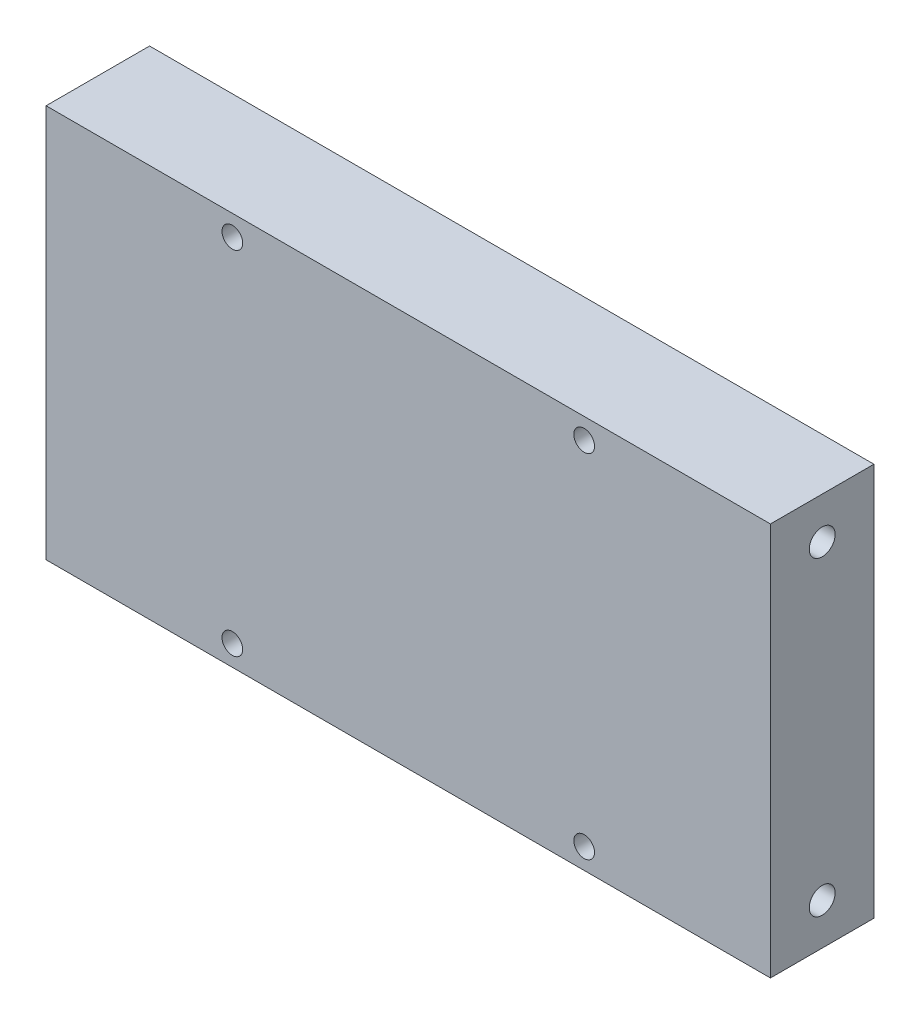
ISO-10303-21;
HEADER;
FILE_DESCRIPTION(('STEP AP214'),'2;1');
FILE_NAME('part.step','',(''),(''),'','','');
FILE_SCHEMA(('AUTOMOTIVE_DESIGN { 1 0 10303 214 1 1 1 1 }'));
ENDSEC;
DATA;
#1=APPLICATION_CONTEXT('core data for automotive mechanical design processes');
#2=APPLICATION_PROTOCOL_DEFINITION('international standard','automotive_design',2000,#1);
#3=PRODUCT_CONTEXT('',#1,'mechanical');
#4=PRODUCT('Part','Part','',(#3));
#5=PRODUCT_RELATED_PRODUCT_CATEGORY('part','',(#4));
#6=PRODUCT_DEFINITION_FORMATION('','',#4);
#7=PRODUCT_DEFINITION_CONTEXT('part definition',#1,'design');
#8=PRODUCT_DEFINITION('design','',#6,#7);
#9=PRODUCT_DEFINITION_SHAPE('','',#8);
#10=(LENGTH_UNIT() NAMED_UNIT(*) SI_UNIT(.MILLI.,.METRE.));
#11=(NAMED_UNIT(*) PLANE_ANGLE_UNIT() SI_UNIT($,.RADIAN.));
#12=(NAMED_UNIT(*) SI_UNIT($,.STERADIAN.) SOLID_ANGLE_UNIT());
#13=UNCERTAINTY_MEASURE_WITH_UNIT(LENGTH_MEASURE(1.E-05),#10,'distance_accuracy_value','');
#14=(GEOMETRIC_REPRESENTATION_CONTEXT(3) GLOBAL_UNCERTAINTY_ASSIGNED_CONTEXT((#13)) GLOBAL_UNIT_ASSIGNED_CONTEXT((#10,
#11,#12)) REPRESENTATION_CONTEXT('',''));
#15=CARTESIAN_POINT('',(0.,0.,0.));
#16=DIRECTION('',(0.,0.,1.));
#17=DIRECTION('',(1.,0.,0.));
#18=AXIS2_PLACEMENT_3D('',#15,#16,#17);
#19=CARTESIAN_POINT('',(0.,0.,10.));
#20=DIRECTION('',(0.,0.,-1.));
#21=DIRECTION('',(-1.,0.,0.));
#22=AXIS2_PLACEMENT_3D('',#19,#20,#21);
#23=PLANE('',#22);
#24=DIRECTION('',(0.,-1.,0.));
#25=VECTOR('',#24,1.);
#26=CARTESIAN_POINT('',(-39.6134615384542,13.9942307692308,10.));
#27=LINE('',#26,#25);
#28=CARTESIAN_POINT('',(-39.6134615384542,13.9942307692308,10.));
#29=VERTEX_POINT('',#28);
#30=CARTESIAN_POINT('',(-39.6134615384542,-24.0057692307692,10.));
#31=VERTEX_POINT('',#30);
#32=EDGE_CURVE('E85',#29,#31,#27,.T.);
#33=ORIENTED_EDGE('',*,*,#32,.T.);
#34=DIRECTION('',(1.,0.,0.));
#35=VECTOR('',#34,1.);
#36=CARTESIAN_POINT('',(30.3865384615459,-24.0057692307692,10.));
#37=LINE('',#36,#35);
#38=CARTESIAN_POINT('',(30.3865384615459,-24.0057692307692,10.));
#39=VERTEX_POINT('',#38);
#40=EDGE_CURVE('E80',#31,#39,#37,.T.);
#41=ORIENTED_EDGE('',*,*,#40,.T.);
#42=DIRECTION('',(0.,1.,0.));
#43=VECTOR('',#42,1.);
#44=CARTESIAN_POINT('',(30.3865384615459,13.9942307692308,10.));
#45=LINE('',#44,#43);
#46=CARTESIAN_POINT('',(30.3865384615459,13.9942307692308,10.));
#47=VERTEX_POINT('',#46);
#48=EDGE_CURVE('E83',#39,#47,#45,.T.);
#49=ORIENTED_EDGE('',*,*,#48,.T.);
#50=DIRECTION('',(-1.,0.,0.));
#51=VECTOR('',#50,1.);
#52=CARTESIAN_POINT('',(30.3865384615459,13.9942307692308,10.));
#53=LINE('',#52,#51);
#54=EDGE_CURVE('E50',#47,#29,#53,.T.);
#55=ORIENTED_EDGE('',*,*,#54,.T.);
#56=EDGE_LOOP('',(#33,#41,#49,#55));
#57=FACE_BOUND('',#56,.T.);
#58=CARTESIAN_POINT('',(-21.6134615384542,11.9942307692338,10.));
#59=DIRECTION('',(0.,0.,1.));
#60=DIRECTION('',(1.,0.,0.));
#61=AXIS2_PLACEMENT_3D('',#58,#59,#60);
#62=CIRCLE('',#61,1.);
#63=CARTESIAN_POINT('',(-20.6134615384542,11.9942307692338,10.));
#64=VERTEX_POINT('',#63);
#65=EDGE_CURVE('E100',#64,#64,#62,.T.);
#66=ORIENTED_EDGE('',*,*,#65,.F.);
#67=EDGE_LOOP('',(#66));
#68=FACE_BOUND('',#67,.T.);
#69=CARTESIAN_POINT('',(12.3865384615458,11.9942307692338,10.));
#70=DIRECTION('',(0.,0.,1.));
#71=DIRECTION('',(1.,0.,0.));
#72=AXIS2_PLACEMENT_3D('',#69,#70,#71);
#73=CIRCLE('',#72,1.);
#74=CARTESIAN_POINT('',(13.3865384615458,11.9942307692338,10.));
#75=VERTEX_POINT('',#74);
#76=EDGE_CURVE('E115',#75,#75,#73,.T.);
#77=ORIENTED_EDGE('',*,*,#76,.F.);
#78=EDGE_LOOP('',(#77));
#79=FACE_BOUND('',#78,.T.);
#80=CARTESIAN_POINT('',(12.3865384615458,-22.0057692307662,10.));
#81=DIRECTION('',(0.,0.,1.));
#82=DIRECTION('',(1.,0.,0.));
#83=AXIS2_PLACEMENT_3D('',#80,#81,#82);
#84=CIRCLE('',#83,1.);
#85=CARTESIAN_POINT('',(13.3865384615458,-22.0057692307662,10.));
#86=VERTEX_POINT('',#85);
#87=EDGE_CURVE('E121',#86,#86,#84,.T.);
#88=ORIENTED_EDGE('',*,*,#87,.F.);
#89=EDGE_LOOP('',(#88));
#90=FACE_BOUND('',#89,.T.);
#91=CARTESIAN_POINT('',(-21.6134615384542,-22.0057692307662,10.));
#92=DIRECTION('',(0.,0.,1.));
#93=DIRECTION('',(1.,0.,0.));
#94=AXIS2_PLACEMENT_3D('',#91,#92,#93);
#95=CIRCLE('',#94,1.);
#96=CARTESIAN_POINT('',(-20.6134615384542,-22.0057692307662,10.));
#97=VERTEX_POINT('',#96);
#98=EDGE_CURVE('E127',#97,#97,#95,.T.);
#99=ORIENTED_EDGE('',*,*,#98,.F.);
#100=EDGE_LOOP('',(#99));
#101=FACE_BOUND('',#100,.T.);
#102=ADVANCED_FACE('F33',(#57,#68,#79,#90,#101),#23,.F.);
#103=CARTESIAN_POINT('',(0.,0.,0.));
#104=DIRECTION('',(0.,0.,-1.));
#105=DIRECTION('',(-1.,0.,0.));
#106=AXIS2_PLACEMENT_3D('',#103,#104,#105);
#107=PLANE('',#106);
#108=CARTESIAN_POINT('',(12.3865384615458,-22.0057692307662,0.));
#109=DIRECTION('',(0.,0.,1.));
#110=DIRECTION('',(1.,0.,0.));
#111=AXIS2_PLACEMENT_3D('',#108,#109,#110);
#112=CIRCLE('',#111,1.);
#113=CARTESIAN_POINT('',(13.3865384615458,-22.0057692307662,0.));
#114=VERTEX_POINT('',#113);
#115=EDGE_CURVE('E124',#114,#114,#112,.T.);
#116=ORIENTED_EDGE('',*,*,#115,.T.);
#117=EDGE_LOOP('',(#116));
#118=FACE_BOUND('',#117,.T.);
#119=CARTESIAN_POINT('',(-21.6134615384542,11.9942307692338,0.));
#120=DIRECTION('',(0.,0.,1.));
#121=DIRECTION('',(1.,0.,0.));
#122=AXIS2_PLACEMENT_3D('',#119,#120,#121);
#123=CIRCLE('',#122,1.);
#124=CARTESIAN_POINT('',(-20.6134615384542,11.9942307692338,0.));
#125=VERTEX_POINT('',#124);
#126=EDGE_CURVE('E112',#125,#125,#123,.T.);
#127=ORIENTED_EDGE('',*,*,#126,.T.);
#128=EDGE_LOOP('',(#127));
#129=FACE_BOUND('',#128,.T.);
#130=DIRECTION('',(0.,-1.,0.));
#131=VECTOR('',#130,1.);
#132=CARTESIAN_POINT('',(-39.6134615384542,13.9942307692308,0.));
#133=LINE('',#132,#131);
#134=CARTESIAN_POINT('',(-39.6134615384542,13.9942307692308,0.));
#135=VERTEX_POINT('',#134);
#136=CARTESIAN_POINT('',(-39.6134615384542,-24.0057692307692,0.));
#137=VERTEX_POINT('',#136);
#138=EDGE_CURVE('E97',#135,#137,#133,.T.);
#139=ORIENTED_EDGE('',*,*,#138,.F.);
#140=DIRECTION('',(-1.,0.,0.));
#141=VECTOR('',#140,1.);
#142=CARTESIAN_POINT('',(30.3865384615459,13.9942307692308,0.));
#143=LINE('',#142,#141);
#144=CARTESIAN_POINT('',(30.3865384615459,13.9942307692308,0.));
#145=VERTEX_POINT('',#144);
#146=EDGE_CURVE('E73',#145,#135,#143,.T.);
#147=ORIENTED_EDGE('',*,*,#146,.F.);
#148=DIRECTION('',(0.,1.,0.));
#149=VECTOR('',#148,1.);
#150=CARTESIAN_POINT('',(30.3865384615459,13.9942307692308,0.));
#151=LINE('',#150,#149);
#152=CARTESIAN_POINT('',(30.3865384615459,-24.0057692307692,0.));
#153=VERTEX_POINT('',#152);
#154=EDGE_CURVE('E67',#153,#145,#151,.T.);
#155=ORIENTED_EDGE('',*,*,#154,.F.);
#156=DIRECTION('',(1.,0.,0.));
#157=VECTOR('',#156,1.);
#158=CARTESIAN_POINT('',(30.3865384615459,-24.0057692307692,0.));
#159=LINE('',#158,#157);
#160=EDGE_CURVE('E89',#137,#153,#159,.T.);
#161=ORIENTED_EDGE('',*,*,#160,.F.);
#162=EDGE_LOOP('',(#139,#147,#155,#161));
#163=FACE_BOUND('',#162,.T.);
#164=CARTESIAN_POINT('',(12.3865384615458,11.9942307692338,0.));
#165=DIRECTION('',(0.,0.,1.));
#166=DIRECTION('',(1.,0.,0.));
#167=AXIS2_PLACEMENT_3D('',#164,#165,#166);
#168=CIRCLE('',#167,1.);
#169=CARTESIAN_POINT('',(13.3865384615458,11.9942307692338,0.));
#170=VERTEX_POINT('',#169);
#171=EDGE_CURVE('E118',#170,#170,#168,.T.);
#172=ORIENTED_EDGE('',*,*,#171,.T.);
#173=EDGE_LOOP('',(#172));
#174=FACE_BOUND('',#173,.T.);
#175=CARTESIAN_POINT('',(-21.6134615384542,-22.0057692307662,0.));
#176=DIRECTION('',(0.,0.,1.));
#177=DIRECTION('',(1.,0.,0.));
#178=AXIS2_PLACEMENT_3D('',#175,#176,#177);
#179=CIRCLE('',#178,1.);
#180=CARTESIAN_POINT('',(-20.6134615384542,-22.0057692307662,0.));
#181=VERTEX_POINT('',#180);
#182=EDGE_CURVE('E130',#181,#181,#179,.T.);
#183=ORIENTED_EDGE('',*,*,#182,.T.);
#184=EDGE_LOOP('',(#183));
#185=FACE_BOUND('',#184,.T.);
#186=ADVANCED_FACE('F108',(#118,#129,#163,#174,#185),#107,.T.);
#187=CARTESIAN_POINT('',(-39.6134615384542,13.9942307692308,10.));
#188=DIRECTION('',(1.,0.,0.));
#189=DIRECTION('',(0.,0.,-1.));
#190=AXIS2_PLACEMENT_3D('',#187,#188,#189);
#191=PLANE('',#190);
#192=CARTESIAN_POINT('',(-39.6134615384542,9.99423076923078,5.));
#193=DIRECTION('',(1.,0.,0.));
#194=DIRECTION('',(0.,0.,-1.));
#195=AXIS2_PLACEMENT_3D('',#192,#193,#194);
#196=CIRCLE('',#195,1.25);
#197=CARTESIAN_POINT('',(-39.6134615384542,9.99423076923078,3.75));
#198=VERTEX_POINT('',#197);
#199=EDGE_CURVE('E154',#198,#198,#196,.T.);
#200=ORIENTED_EDGE('',*,*,#199,.T.);
#201=EDGE_LOOP('',(#200));
#202=FACE_BOUND('',#201,.T.);
#203=CARTESIAN_POINT('',(-39.6134615384542,-20.0057692307692,5.));
#204=DIRECTION('',(1.,0.,0.));
#205=DIRECTION('',(0.,0.,-1.));
#206=AXIS2_PLACEMENT_3D('',#203,#204,#205);
#207=CIRCLE('',#206,1.25);
#208=CARTESIAN_POINT('',(-39.6134615384542,-20.0057692307692,3.75));
#209=VERTEX_POINT('',#208);
#210=EDGE_CURVE('E148',#209,#209,#207,.T.);
#211=ORIENTED_EDGE('',*,*,#210,.T.);
#212=EDGE_LOOP('',(#211));
#213=FACE_BOUND('',#212,.T.);
#214=ORIENTED_EDGE('',*,*,#138,.T.);
#215=DIRECTION('',(0.,0.,-1.));
#216=VECTOR('',#215,1.);
#217=CARTESIAN_POINT('',(-39.6134615384542,-24.0057692307692,10.));
#218=LINE('',#217,#216);
#219=EDGE_CURVE('E11',#31,#137,#218,.T.);
#220=ORIENTED_EDGE('',*,*,#219,.F.);
#221=ORIENTED_EDGE('',*,*,#32,.F.);
#222=DIRECTION('',(0.,0.,-1.));
#223=VECTOR('',#222,1.);
#224=CARTESIAN_POINT('',(-39.6134615384542,13.9942307692308,10.));
#225=LINE('',#224,#223);
#226=EDGE_CURVE('E93',#29,#135,#225,.T.);
#227=ORIENTED_EDGE('',*,*,#226,.T.);
#228=EDGE_LOOP('',(#214,#220,#221,#227));
#229=FACE_BOUND('',#228,.T.);
#230=ADVANCED_FACE('F35',(#202,#213,#229),#191,.F.);
#231=CARTESIAN_POINT('',(30.3865384615459,-24.0057692307692,10.));
#232=DIRECTION('',(0.,1.,0.));
#233=DIRECTION('',(0.,0.,1.));
#234=AXIS2_PLACEMENT_3D('',#231,#232,#233);
#235=PLANE('',#234);
#236=ORIENTED_EDGE('',*,*,#160,.T.);
#237=DIRECTION('',(0.,0.,-1.));
#238=VECTOR('',#237,1.);
#239=CARTESIAN_POINT('',(30.3865384615459,-24.0057692307692,10.));
#240=LINE('',#239,#238);
#241=EDGE_CURVE('E42',#39,#153,#240,.T.);
#242=ORIENTED_EDGE('',*,*,#241,.F.);
#243=ORIENTED_EDGE('',*,*,#40,.F.);
#244=ORIENTED_EDGE('',*,*,#219,.T.);
#245=EDGE_LOOP('',(#236,#242,#243,#244));
#246=FACE_BOUND('',#245,.T.);
#247=ADVANCED_FACE('F88',(#246),#235,.F.);
#248=CARTESIAN_POINT('',(30.3865384615459,13.9942307692308,10.));
#249=DIRECTION('',(-1.,0.,0.));
#250=DIRECTION('',(0.,0.,1.));
#251=AXIS2_PLACEMENT_3D('',#248,#249,#250);
#252=PLANE('',#251);
#253=CARTESIAN_POINT('',(30.3865384615459,9.99423076923078,5.));
#254=DIRECTION('',(1.,0.,0.));
#255=DIRECTION('',(0.,0.,-1.));
#256=AXIS2_PLACEMENT_3D('',#253,#254,#255);
#257=CIRCLE('',#256,1.25);
#258=CARTESIAN_POINT('',(30.3865384615459,9.99423076923078,3.75));
#259=VERTEX_POINT('',#258);
#260=EDGE_CURVE('E143',#259,#259,#257,.T.);
#261=ORIENTED_EDGE('',*,*,#260,.F.);
#262=EDGE_LOOP('',(#261));
#263=FACE_BOUND('',#262,.T.);
#264=CARTESIAN_POINT('',(30.3865384615459,-20.0057692307692,5.));
#265=DIRECTION('',(1.,0.,0.));
#266=DIRECTION('',(0.,0.,-1.));
#267=AXIS2_PLACEMENT_3D('',#264,#265,#266);
#268=CIRCLE('',#267,1.25);
#269=CARTESIAN_POINT('',(30.3865384615459,-20.0057692307692,3.75));
#270=VERTEX_POINT('',#269);
#271=EDGE_CURVE('E136',#270,#270,#268,.T.);
#272=ORIENTED_EDGE('',*,*,#271,.F.);
#273=EDGE_LOOP('',(#272));
#274=FACE_BOUND('',#273,.T.);
#275=ORIENTED_EDGE('',*,*,#154,.T.);
#276=DIRECTION('',(0.,0.,-1.));
#277=VECTOR('',#276,1.);
#278=CARTESIAN_POINT('',(30.3865384615459,13.9942307692308,10.));
#279=LINE('',#278,#277);
#280=EDGE_CURVE('E90',#47,#145,#279,.T.);
#281=ORIENTED_EDGE('',*,*,#280,.F.);
#282=ORIENTED_EDGE('',*,*,#48,.F.);
#283=ORIENTED_EDGE('',*,*,#241,.T.);
#284=EDGE_LOOP('',(#275,#281,#282,#283));
#285=FACE_BOUND('',#284,.T.);
#286=ADVANCED_FACE('F91',(#263,#274,#285),#252,.F.);
#287=CARTESIAN_POINT('',(30.3865384615459,13.9942307692308,10.));
#288=DIRECTION('',(0.,-1.,0.));
#289=DIRECTION('',(0.,0.,-1.));
#290=AXIS2_PLACEMENT_3D('',#287,#288,#289);
#291=PLANE('',#290);
#292=ORIENTED_EDGE('',*,*,#146,.T.);
#293=ORIENTED_EDGE('',*,*,#226,.F.);
#294=ORIENTED_EDGE('',*,*,#54,.F.);
#295=ORIENTED_EDGE('',*,*,#280,.T.);
#296=EDGE_LOOP('',(#292,#293,#294,#295));
#297=FACE_BOUND('',#296,.T.);
#298=ADVANCED_FACE('F105',(#297),#291,.F.);
#299=CARTESIAN_POINT('',(-21.6134615384542,11.9942307692338,10.));
#300=DIRECTION('',(0.,0.,-1.));
#301=DIRECTION('',(-1.,0.,0.));
#302=AXIS2_PLACEMENT_3D('',#299,#300,#301);
#303=CYLINDRICAL_SURFACE('',#302,1.);
#304=ORIENTED_EDGE('',*,*,#65,.T.);
#305=EDGE_LOOP('',(#304));
#306=FACE_BOUND('',#305,.T.);
#307=ORIENTED_EDGE('',*,*,#126,.F.);
#308=EDGE_LOOP('',(#307));
#309=FACE_BOUND('',#308,.T.);
#310=ADVANCED_FACE('F179',(#306,#309),#303,.F.);
#311=CARTESIAN_POINT('',(12.3865384615458,11.9942307692338,10.));
#312=DIRECTION('',(0.,0.,-1.));
#313=DIRECTION('',(-1.,0.,0.));
#314=AXIS2_PLACEMENT_3D('',#311,#312,#313);
#315=CYLINDRICAL_SURFACE('',#314,1.);
#316=ORIENTED_EDGE('',*,*,#76,.T.);
#317=EDGE_LOOP('',(#316));
#318=FACE_BOUND('',#317,.T.);
#319=ORIENTED_EDGE('',*,*,#171,.F.);
#320=EDGE_LOOP('',(#319));
#321=FACE_BOUND('',#320,.T.);
#322=ADVANCED_FACE('F229',(#318,#321),#315,.F.);
#323=CARTESIAN_POINT('',(12.3865384615458,-22.0057692307662,10.));
#324=DIRECTION('',(0.,0.,-1.));
#325=DIRECTION('',(-1.,0.,0.));
#326=AXIS2_PLACEMENT_3D('',#323,#324,#325);
#327=CYLINDRICAL_SURFACE('',#326,1.);
#328=ORIENTED_EDGE('',*,*,#87,.T.);
#329=EDGE_LOOP('',(#328));
#330=FACE_BOUND('',#329,.T.);
#331=ORIENTED_EDGE('',*,*,#115,.F.);
#332=EDGE_LOOP('',(#331));
#333=FACE_BOUND('',#332,.T.);
#334=ADVANCED_FACE('F226',(#330,#333),#327,.F.);
#335=CARTESIAN_POINT('',(-21.6134615384542,-22.0057692307662,10.));
#336=DIRECTION('',(0.,0.,-1.));
#337=DIRECTION('',(-1.,0.,0.));
#338=AXIS2_PLACEMENT_3D('',#335,#336,#337);
#339=CYLINDRICAL_SURFACE('',#338,1.);
#340=ORIENTED_EDGE('',*,*,#98,.T.);
#341=EDGE_LOOP('',(#340));
#342=FACE_BOUND('',#341,.T.);
#343=ORIENTED_EDGE('',*,*,#182,.F.);
#344=EDGE_LOOP('',(#343));
#345=FACE_BOUND('',#344,.T.);
#346=ADVANCED_FACE('F222',(#342,#345),#339,.F.);
#347=CARTESIAN_POINT('',(18.3865384615459,-20.0057692307692,5.));
#348=DIRECTION('',(1.,0.,0.));
#349=DIRECTION('',(0.,0.,-1.));
#350=AXIS2_PLACEMENT_3D('',#347,#348,#349);
#351=CYLINDRICAL_SURFACE('',#350,1.25);
#352=CARTESIAN_POINT('',(18.3865384615459,-20.0057692307692,5.));
#353=DIRECTION('',(1.,0.,0.));
#354=DIRECTION('',(0.,0.,-1.));
#355=AXIS2_PLACEMENT_3D('',#352,#353,#354);
#356=CIRCLE('',#355,1.25);
#357=CARTESIAN_POINT('',(18.3865384615459,-20.0057692307692,3.75));
#358=VERTEX_POINT('',#357);
#359=EDGE_CURVE('E139',#358,#358,#356,.T.);
#360=ORIENTED_EDGE('',*,*,#359,.F.);
#361=EDGE_LOOP('',(#360));
#362=FACE_BOUND('',#361,.T.);
#363=ORIENTED_EDGE('',*,*,#271,.T.);
#364=EDGE_LOOP('',(#363));
#365=FACE_BOUND('',#364,.T.);
#366=ADVANCED_FACE('F218',(#362,#365),#351,.F.);
#367=CARTESIAN_POINT('',(18.3865384615459,-20.0057692307692,5.));
#368=DIRECTION('',(1.,0.,0.));
#369=DIRECTION('',(0.,0.,-1.));
#370=AXIS2_PLACEMENT_3D('',#367,#368,#369);
#371=PLANE('',#370);
#372=ORIENTED_EDGE('',*,*,#359,.T.);
#373=EDGE_LOOP('',(#372));
#374=FACE_BOUND('',#373,.T.);
#375=ADVANCED_FACE('F214',(#374),#371,.T.);
#376=CARTESIAN_POINT('',(18.3865384615459,9.99423076923078,5.));
#377=DIRECTION('',(1.,0.,0.));
#378=DIRECTION('',(0.,0.,-1.));
#379=AXIS2_PLACEMENT_3D('',#376,#377,#378);
#380=CYLINDRICAL_SURFACE('',#379,1.25);
#381=CARTESIAN_POINT('',(18.3865384615459,9.99423076923078,5.));
#382=DIRECTION('',(1.,0.,0.));
#383=DIRECTION('',(0.,0.,-1.));
#384=AXIS2_PLACEMENT_3D('',#381,#382,#383);
#385=CIRCLE('',#384,1.25);
#386=CARTESIAN_POINT('',(18.3865384615459,9.99423076923078,3.75));
#387=VERTEX_POINT('',#386);
#388=EDGE_CURVE('E133',#387,#387,#385,.T.);
#389=ORIENTED_EDGE('',*,*,#388,.F.);
#390=EDGE_LOOP('',(#389));
#391=FACE_BOUND('',#390,.T.);
#392=ORIENTED_EDGE('',*,*,#260,.T.);
#393=EDGE_LOOP('',(#392));
#394=FACE_BOUND('',#393,.T.);
#395=ADVANCED_FACE('F208',(#391,#394),#380,.F.);
#396=CARTESIAN_POINT('',(18.3865384615459,9.99423076923078,5.));
#397=DIRECTION('',(1.,0.,0.));
#398=DIRECTION('',(0.,0.,-1.));
#399=AXIS2_PLACEMENT_3D('',#396,#397,#398);
#400=PLANE('',#399);
#401=ORIENTED_EDGE('',*,*,#388,.T.);
#402=EDGE_LOOP('',(#401));
#403=FACE_BOUND('',#402,.T.);
#404=ADVANCED_FACE('F199',(#403),#400,.T.);
#405=CARTESIAN_POINT('',(-27.6134615384542,-20.0057692307692,5.));
#406=DIRECTION('',(-1.,0.,0.));
#407=DIRECTION('',(0.,0.,1.));
#408=AXIS2_PLACEMENT_3D('',#405,#406,#407);
#409=CYLINDRICAL_SURFACE('',#408,1.25);
#410=CARTESIAN_POINT('',(-27.6134615384542,-20.0057692307692,5.));
#411=DIRECTION('',(1.,0.,0.));
#412=DIRECTION('',(0.,0.,-1.));
#413=AXIS2_PLACEMENT_3D('',#410,#411,#412);
#414=CIRCLE('',#413,1.25);
#415=CARTESIAN_POINT('',(-27.6134615384542,-20.0057692307692,3.75));
#416=VERTEX_POINT('',#415);
#417=EDGE_CURVE('E151',#416,#416,#414,.T.);
#418=ORIENTED_EDGE('',*,*,#417,.T.);
#419=EDGE_LOOP('',(#418));
#420=FACE_BOUND('',#419,.T.);
#421=ORIENTED_EDGE('',*,*,#210,.F.);
#422=EDGE_LOOP('',(#421));
#423=FACE_BOUND('',#422,.T.);
#424=ADVANCED_FACE('F197',(#420,#423),#409,.F.);
#425=CARTESIAN_POINT('',(-27.6134615384542,-20.0057692307692,5.));
#426=DIRECTION('',(-1.,0.,0.));
#427=DIRECTION('',(0.,0.,-1.));
#428=AXIS2_PLACEMENT_3D('',#425,#426,#427);
#429=PLANE('',#428);
#430=ORIENTED_EDGE('',*,*,#417,.F.);
#431=EDGE_LOOP('',(#430));
#432=FACE_BOUND('',#431,.T.);
#433=ADVANCED_FACE('F169',(#432),#429,.T.);
#434=CARTESIAN_POINT('',(-27.6134615384542,9.99423076923078,5.));
#435=DIRECTION('',(-1.,0.,0.));
#436=DIRECTION('',(0.,0.,1.));
#437=AXIS2_PLACEMENT_3D('',#434,#435,#436);
#438=CYLINDRICAL_SURFACE('',#437,1.25);
#439=CARTESIAN_POINT('',(-27.6134615384542,9.99423076923078,5.));
#440=DIRECTION('',(1.,0.,0.));
#441=DIRECTION('',(0.,0.,-1.));
#442=AXIS2_PLACEMENT_3D('',#439,#440,#441);
#443=CIRCLE('',#442,1.25);
#444=CARTESIAN_POINT('',(-27.6134615384542,9.99423076923078,3.75));
#445=VERTEX_POINT('',#444);
#446=EDGE_CURVE('E140',#445,#445,#443,.T.);
#447=ORIENTED_EDGE('',*,*,#446,.T.);
#448=EDGE_LOOP('',(#447));
#449=FACE_BOUND('',#448,.T.);
#450=ORIENTED_EDGE('',*,*,#199,.F.);
#451=EDGE_LOOP('',(#450));
#452=FACE_BOUND('',#451,.T.);
#453=ADVANCED_FACE('F160',(#449,#452),#438,.F.);
#454=CARTESIAN_POINT('',(-27.6134615384542,9.99423076923078,5.));
#455=DIRECTION('',(-1.,0.,0.));
#456=DIRECTION('',(0.,0.,-1.));
#457=AXIS2_PLACEMENT_3D('',#454,#455,#456);
#458=PLANE('',#457);
#459=ORIENTED_EDGE('',*,*,#446,.F.);
#460=EDGE_LOOP('',(#459));
#461=FACE_BOUND('',#460,.T.);
#462=ADVANCED_FACE('F163',(#461),#458,.T.);
#463=CLOSED_SHELL('',(#102,#186,#230,#247,#286,#298,#310,#322,#334,#346,#366,#375,#395,#404,
#424,#433,#453,#462));
#464=MANIFOLD_SOLID_BREP('B2',#463);
#465=ADVANCED_BREP_SHAPE_REPRESENTATION('',(#18,#464),#14);
#466=SHAPE_DEFINITION_REPRESENTATION(#9,#465);
ENDSEC;
END-ISO-10303-21;
